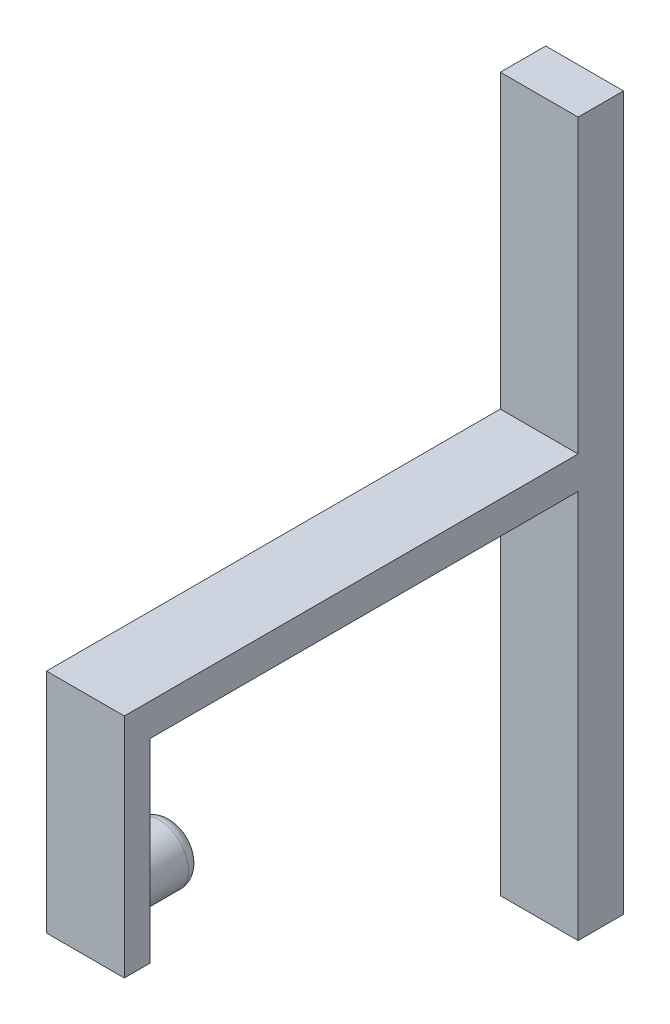
ISO-10303-21;
HEADER;
FILE_DESCRIPTION(('STEP AP214'),'2;1');
FILE_NAME('part.step','',(''),(''),'','','');
FILE_SCHEMA(('AUTOMOTIVE_DESIGN { 1 0 10303 214 1 1 1 1 }'));
ENDSEC;
DATA;
#1=APPLICATION_CONTEXT('core data for automotive mechanical design processes');
#2=APPLICATION_PROTOCOL_DEFINITION('international standard','automotive_design',2000,#1);
#3=PRODUCT_CONTEXT('',#1,'mechanical');
#4=PRODUCT('Part','Part','',(#3));
#5=PRODUCT_RELATED_PRODUCT_CATEGORY('part','',(#4));
#6=PRODUCT_DEFINITION_FORMATION('','',#4);
#7=PRODUCT_DEFINITION_CONTEXT('part definition',#1,'design');
#8=PRODUCT_DEFINITION('design','',#6,#7);
#9=PRODUCT_DEFINITION_SHAPE('','',#8);
#10=(LENGTH_UNIT() NAMED_UNIT(*) SI_UNIT(.MILLI.,.METRE.));
#11=(NAMED_UNIT(*) PLANE_ANGLE_UNIT() SI_UNIT($,.RADIAN.));
#12=(NAMED_UNIT(*) SI_UNIT($,.STERADIAN.) SOLID_ANGLE_UNIT());
#13=UNCERTAINTY_MEASURE_WITH_UNIT(LENGTH_MEASURE(1.E-05),#10,'distance_accuracy_value','');
#14=(GEOMETRIC_REPRESENTATION_CONTEXT(3) GLOBAL_UNCERTAINTY_ASSIGNED_CONTEXT((#13)) GLOBAL_UNIT_ASSIGNED_CONTEXT((#10,
#11,#12)) REPRESENTATION_CONTEXT('',''));
#15=CARTESIAN_POINT('',(0.,0.,0.));
#16=DIRECTION('',(0.,0.,1.));
#17=DIRECTION('',(1.,0.,0.));
#18=AXIS2_PLACEMENT_3D('',#15,#16,#17);
#19=CARTESIAN_POINT('',(0.,30.,38.5));
#20=DIRECTION('',(0.,1.,0.));
#21=DIRECTION('',(0.,0.,1.));
#22=AXIS2_PLACEMENT_3D('',#19,#20,#21);
#23=PLANE('',#22);
#24=DIRECTION('',(1.,0.,0.));
#25=VECTOR('',#24,1.);
#26=CARTESIAN_POINT('',(6.,30.,36.5));
#27=LINE('',#26,#25);
#28=CARTESIAN_POINT('',(0.,30.,36.5));
#29=VERTEX_POINT('',#28);
#30=CARTESIAN_POINT('',(6.,30.,36.5));
#31=VERTEX_POINT('',#30);
#32=EDGE_CURVE('E147',#29,#31,#27,.T.);
#33=ORIENTED_EDGE('',*,*,#32,.F.);
#34=DIRECTION('',(0.,0.,-1.));
#35=VECTOR('',#34,1.);
#36=CARTESIAN_POINT('',(0.,30.,38.5));
#37=LINE('',#36,#35);
#38=CARTESIAN_POINT('',(0.,30.,3.5));
#39=VERTEX_POINT('',#38);
#40=EDGE_CURVE('E160',#29,#39,#37,.T.);
#41=ORIENTED_EDGE('',*,*,#40,.T.);
#42=DIRECTION('',(1.,0.,0.));
#43=VECTOR('',#42,1.);
#44=CARTESIAN_POINT('',(0.,30.,3.5));
#45=LINE('',#44,#43);
#46=CARTESIAN_POINT('',(6.,30.,3.5));
#47=VERTEX_POINT('',#46);
#48=EDGE_CURVE('E156',#39,#47,#45,.T.);
#49=ORIENTED_EDGE('',*,*,#48,.T.);
#50=DIRECTION('',(0.,0.,-1.));
#51=VECTOR('',#50,1.);
#52=CARTESIAN_POINT('',(6.,30.,38.5));
#53=LINE('',#52,#51);
#54=EDGE_CURVE('E168',#31,#47,#53,.T.);
#55=ORIENTED_EDGE('',*,*,#54,.F.);
#56=EDGE_LOOP('',(#33,#41,#49,#55));
#57=FACE_BOUND('',#56,.T.);
#58=ADVANCED_FACE('F33',(#57),#23,.F.);
#59=CARTESIAN_POINT('',(0.,0.,3.5));
#60=DIRECTION('',(0.,0.,-1.));
#61=DIRECTION('',(-1.,0.,0.));
#62=AXIS2_PLACEMENT_3D('',#59,#60,#61);
#63=PLANE('',#62);
#64=ORIENTED_EDGE('',*,*,#48,.F.);
#65=DIRECTION('',(0.,-1.,0.));
#66=VECTOR('',#65,1.);
#67=CARTESIAN_POINT('',(0.,0.,3.5));
#68=LINE('',#67,#66);
#69=CARTESIAN_POINT('',(0.,0.,3.5));
#70=VERTEX_POINT('',#69);
#71=EDGE_CURVE('E86',#39,#70,#68,.T.);
#72=ORIENTED_EDGE('',*,*,#71,.T.);
#73=DIRECTION('',(1.,0.,0.));
#74=VECTOR('',#73,1.);
#75=CARTESIAN_POINT('',(0.,0.,3.5));
#76=LINE('',#75,#74);
#77=CARTESIAN_POINT('',(6.,0.,3.5));
#78=VERTEX_POINT('',#77);
#79=EDGE_CURVE('E173',#70,#78,#76,.T.);
#80=ORIENTED_EDGE('',*,*,#79,.T.);
#81=DIRECTION('',(0.,1.,0.));
#82=VECTOR('',#81,1.);
#83=CARTESIAN_POINT('',(6.,0.,3.5));
#84=LINE('',#83,#82);
#85=EDGE_CURVE('E176',#78,#47,#84,.T.);
#86=ORIENTED_EDGE('',*,*,#85,.T.);
#87=EDGE_LOOP('',(#64,#72,#80,#86));
#88=FACE_BOUND('',#87,.T.);
#89=ADVANCED_FACE('F213',(#88),#63,.F.);
#90=CARTESIAN_POINT('',(0.,0.,3.5));
#91=DIRECTION('',(1.,0.,0.));
#92=DIRECTION('',(0.,0.,-1.));
#93=AXIS2_PLACEMENT_3D('',#90,#91,#92);
#94=PLANE('',#93);
#95=DIRECTION('',(0.,-1.,0.));
#96=VECTOR('',#95,1.);
#97=CARTESIAN_POINT('',(0.,0.,0.));
#98=LINE('',#97,#96);
#99=CARTESIAN_POINT('',(0.,55.,0.));
#100=VERTEX_POINT('',#99);
#101=CARTESIAN_POINT('',(0.,0.,0.));
#102=VERTEX_POINT('',#101);
#103=EDGE_CURVE('E170',#100,#102,#98,.T.);
#104=ORIENTED_EDGE('',*,*,#103,.T.);
#105=DIRECTION('',(0.,0.,-1.));
#106=VECTOR('',#105,1.);
#107=CARTESIAN_POINT('',(0.,0.,3.5));
#108=LINE('',#107,#106);
#109=EDGE_CURVE('E194',#70,#102,#108,.T.);
#110=ORIENTED_EDGE('',*,*,#109,.F.);
#111=ORIENTED_EDGE('',*,*,#71,.F.);
#112=ORIENTED_EDGE('',*,*,#40,.F.);
#113=DIRECTION('',(0.,1.,0.));
#114=VECTOR('',#113,1.);
#115=CARTESIAN_POINT('',(0.,15.,36.5));
#116=LINE('',#115,#114);
#117=CARTESIAN_POINT('',(0.,15.,36.5));
#118=VERTEX_POINT('',#117);
#119=EDGE_CURVE('E155',#118,#29,#116,.T.);
#120=ORIENTED_EDGE('',*,*,#119,.F.);
#121=DIRECTION('',(0.,0.,-1.));
#122=VECTOR('',#121,1.);
#123=CARTESIAN_POINT('',(0.,15.,38.5));
#124=LINE('',#123,#122);
#125=CARTESIAN_POINT('',(0.,15.,38.5));
#126=VERTEX_POINT('',#125);
#127=EDGE_CURVE('E141',#126,#118,#124,.T.);
#128=ORIENTED_EDGE('',*,*,#127,.F.);
#129=DIRECTION('',(0.,1.,0.));
#130=VECTOR('',#129,1.);
#131=CARTESIAN_POINT('',(0.,30.,38.5));
#132=LINE('',#131,#130);
#133=CARTESIAN_POINT('',(0.,32.5,38.5));
#134=VERTEX_POINT('',#133);
#135=EDGE_CURVE('E138',#126,#134,#132,.T.);
#136=ORIENTED_EDGE('',*,*,#135,.T.);
#137=DIRECTION('',(0.,0.,-1.));
#138=VECTOR('',#137,1.);
#139=CARTESIAN_POINT('',(0.,32.5,38.5));
#140=LINE('',#139,#138);
#141=CARTESIAN_POINT('',(0.,32.5,3.5));
#142=VERTEX_POINT('',#141);
#143=EDGE_CURVE('E165',#134,#142,#140,.T.);
#144=ORIENTED_EDGE('',*,*,#143,.T.);
#145=CARTESIAN_POINT('',(0.,55.,3.5));
#146=VERTEX_POINT('',#145);
#147=EDGE_CURVE('E171',#146,#142,#68,.T.);
#148=ORIENTED_EDGE('',*,*,#147,.F.);
#149=DIRECTION('',(0.,0.,-1.));
#150=VECTOR('',#149,1.);
#151=CARTESIAN_POINT('',(0.,55.,3.5));
#152=LINE('',#151,#150);
#153=EDGE_CURVE('E180',#146,#100,#152,.T.);
#154=ORIENTED_EDGE('',*,*,#153,.T.);
#155=EDGE_LOOP('',(#104,#110,#111,#112,#120,#128,#136,#144,#148,#154));
#156=FACE_BOUND('',#155,.T.);
#157=ADVANCED_FACE('F219',(#156),#94,.F.);
#158=CARTESIAN_POINT('',(0.,0.,3.5));
#159=DIRECTION('',(0.,1.,0.));
#160=DIRECTION('',(0.,0.,1.));
#161=AXIS2_PLACEMENT_3D('',#158,#159,#160);
#162=PLANE('',#161);
#163=DIRECTION('',(1.,0.,0.));
#164=VECTOR('',#163,1.);
#165=CARTESIAN_POINT('',(0.,0.,0.));
#166=LINE('',#165,#164);
#167=CARTESIAN_POINT('',(6.,0.,0.));
#168=VERTEX_POINT('',#167);
#169=EDGE_CURVE('E183',#102,#168,#166,.T.);
#170=ORIENTED_EDGE('',*,*,#169,.T.);
#171=DIRECTION('',(0.,0.,-1.));
#172=VECTOR('',#171,1.);
#173=CARTESIAN_POINT('',(6.,0.,3.5));
#174=LINE('',#173,#172);
#175=EDGE_CURVE('E191',#78,#168,#174,.T.);
#176=ORIENTED_EDGE('',*,*,#175,.F.);
#177=ORIENTED_EDGE('',*,*,#79,.F.);
#178=ORIENTED_EDGE('',*,*,#109,.T.);
#179=EDGE_LOOP('',(#170,#176,#177,#178));
#180=FACE_BOUND('',#179,.T.);
#181=ADVANCED_FACE('F237',(#180),#162,.F.);
#182=CARTESIAN_POINT('',(6.,0.,3.5));
#183=DIRECTION('',(-1.,0.,0.));
#184=DIRECTION('',(0.,0.,1.));
#185=AXIS2_PLACEMENT_3D('',#182,#183,#184);
#186=PLANE('',#185);
#187=DIRECTION('',(0.,1.,0.));
#188=VECTOR('',#187,1.);
#189=CARTESIAN_POINT('',(6.,0.,0.));
#190=LINE('',#189,#188);
#191=CARTESIAN_POINT('',(6.,55.,0.));
#192=VERTEX_POINT('',#191);
#193=EDGE_CURVE('E185',#168,#192,#190,.T.);
#194=ORIENTED_EDGE('',*,*,#193,.T.);
#195=DIRECTION('',(0.,0.,-1.));
#196=VECTOR('',#195,1.);
#197=CARTESIAN_POINT('',(6.,55.,3.5));
#198=LINE('',#197,#196);
#199=CARTESIAN_POINT('',(6.,55.,3.5));
#200=VERTEX_POINT('',#199);
#201=EDGE_CURVE('E189',#200,#192,#198,.T.);
#202=ORIENTED_EDGE('',*,*,#201,.F.);
#203=CARTESIAN_POINT('',(6.,32.5,3.5));
#204=VERTEX_POINT('',#203);
#205=EDGE_CURVE('E175',#204,#200,#84,.T.);
#206=ORIENTED_EDGE('',*,*,#205,.F.);
#207=DIRECTION('',(0.,0.,-1.));
#208=VECTOR('',#207,1.);
#209=CARTESIAN_POINT('',(6.,32.5,38.5));
#210=LINE('',#209,#208);
#211=CARTESIAN_POINT('',(6.,32.5,38.5));
#212=VERTEX_POINT('',#211);
#213=EDGE_CURVE('E48',#212,#204,#210,.T.);
#214=ORIENTED_EDGE('',*,*,#213,.F.);
#215=DIRECTION('',(0.,1.,0.));
#216=VECTOR('',#215,1.);
#217=CARTESIAN_POINT('',(6.,30.,38.5));
#218=LINE('',#217,#216);
#219=CARTESIAN_POINT('',(6.,15.,38.5));
#220=VERTEX_POINT('',#219);
#221=EDGE_CURVE('E122',#220,#212,#218,.T.);
#222=ORIENTED_EDGE('',*,*,#221,.F.);
#223=DIRECTION('',(0.,0.,1.));
#224=VECTOR('',#223,1.);
#225=CARTESIAN_POINT('',(6.,15.,38.5));
#226=LINE('',#225,#224);
#227=CARTESIAN_POINT('',(6.,15.,36.5));
#228=VERTEX_POINT('',#227);
#229=EDGE_CURVE('E127',#228,#220,#226,.T.);
#230=ORIENTED_EDGE('',*,*,#229,.F.);
#231=DIRECTION('',(0.,1.,0.));
#232=VECTOR('',#231,1.);
#233=CARTESIAN_POINT('',(6.,15.,36.5));
#234=LINE('',#233,#232);
#235=EDGE_CURVE('E152',#228,#31,#234,.T.);
#236=ORIENTED_EDGE('',*,*,#235,.T.);
#237=ORIENTED_EDGE('',*,*,#54,.T.);
#238=ORIENTED_EDGE('',*,*,#85,.F.);
#239=ORIENTED_EDGE('',*,*,#175,.T.);
#240=EDGE_LOOP('',(#194,#202,#206,#214,#222,#230,#236,#237,#238,#239));
#241=FACE_BOUND('',#240,.T.);
#242=ADVANCED_FACE('F124',(#241),#186,.F.);
#243=CARTESIAN_POINT('',(0.,55.,3.5));
#244=DIRECTION('',(0.,-1.,0.));
#245=DIRECTION('',(0.,0.,-1.));
#246=AXIS2_PLACEMENT_3D('',#243,#244,#245);
#247=PLANE('',#246);
#248=DIRECTION('',(-1.,0.,0.));
#249=VECTOR('',#248,1.);
#250=CARTESIAN_POINT('',(0.,55.,0.));
#251=LINE('',#250,#249);
#252=EDGE_CURVE('E78',#192,#100,#251,.T.);
#253=ORIENTED_EDGE('',*,*,#252,.T.);
#254=ORIENTED_EDGE('',*,*,#153,.F.);
#255=DIRECTION('',(-1.,0.,0.));
#256=VECTOR('',#255,1.);
#257=CARTESIAN_POINT('',(0.,55.,3.5));
#258=LINE('',#257,#256);
#259=EDGE_CURVE('E57',#200,#146,#258,.T.);
#260=ORIENTED_EDGE('',*,*,#259,.F.);
#261=ORIENTED_EDGE('',*,*,#201,.T.);
#262=EDGE_LOOP('',(#253,#254,#260,#261));
#263=FACE_BOUND('',#262,.T.);
#264=ADVANCED_FACE('F229',(#263),#247,.F.);
#265=ORIENTED_EDGE('',*,*,#147,.T.);
#266=DIRECTION('',(1.,0.,0.));
#267=VECTOR('',#266,1.);
#268=CARTESIAN_POINT('',(0.,32.5,3.5));
#269=LINE('',#268,#267);
#270=EDGE_CURVE('E132',#142,#204,#269,.T.);
#271=ORIENTED_EDGE('',*,*,#270,.T.);
#272=ORIENTED_EDGE('',*,*,#205,.T.);
#273=ORIENTED_EDGE('',*,*,#259,.T.);
#274=EDGE_LOOP('',(#265,#271,#272,#273));
#275=FACE_BOUND('',#274,.T.);
#276=ADVANCED_FACE('F221',(#275),#63,.F.);
#277=CARTESIAN_POINT('',(0.,0.,0.));
#278=DIRECTION('',(0.,0.,-1.));
#279=DIRECTION('',(-1.,0.,0.));
#280=AXIS2_PLACEMENT_3D('',#277,#278,#279);
#281=PLANE('',#280);
#282=ORIENTED_EDGE('',*,*,#103,.F.);
#283=ORIENTED_EDGE('',*,*,#252,.F.);
#284=ORIENTED_EDGE('',*,*,#193,.F.);
#285=ORIENTED_EDGE('',*,*,#169,.F.);
#286=EDGE_LOOP('',(#282,#283,#284,#285));
#287=FACE_BOUND('',#286,.T.);
#288=ADVANCED_FACE('F228',(#287),#281,.T.);
#289=CARTESIAN_POINT('',(0.,32.5,38.5));
#290=DIRECTION('',(0.,1.,0.));
#291=DIRECTION('',(0.,0.,1.));
#292=AXIS2_PLACEMENT_3D('',#289,#290,#291);
#293=PLANE('',#292);
#294=ORIENTED_EDGE('',*,*,#270,.F.);
#295=ORIENTED_EDGE('',*,*,#143,.F.);
#296=DIRECTION('',(1.,0.,0.));
#297=VECTOR('',#296,1.);
#298=CARTESIAN_POINT('',(0.,32.5,38.5));
#299=LINE('',#298,#297);
#300=EDGE_CURVE('E131',#134,#212,#299,.T.);
#301=ORIENTED_EDGE('',*,*,#300,.T.);
#302=ORIENTED_EDGE('',*,*,#213,.T.);
#303=EDGE_LOOP('',(#294,#295,#301,#302));
#304=FACE_BOUND('',#303,.T.);
#305=ADVANCED_FACE('F224',(#304),#293,.T.);
#306=CARTESIAN_POINT('',(0.,0.,38.5));
#307=DIRECTION('',(0.,0.,1.));
#308=DIRECTION('',(1.,0.,0.));
#309=AXIS2_PLACEMENT_3D('',#306,#307,#308);
#310=PLANE('',#309);
#311=ORIENTED_EDGE('',*,*,#135,.F.);
#312=DIRECTION('',(-1.,0.,0.));
#313=VECTOR('',#312,1.);
#314=CARTESIAN_POINT('',(6.,15.,38.5));
#315=LINE('',#314,#313);
#316=EDGE_CURVE('E135',#220,#126,#315,.T.);
#317=ORIENTED_EDGE('',*,*,#316,.F.);
#318=ORIENTED_EDGE('',*,*,#221,.T.);
#319=ORIENTED_EDGE('',*,*,#300,.F.);
#320=EDGE_LOOP('',(#311,#317,#318,#319));
#321=FACE_BOUND('',#320,.T.);
#322=ADVANCED_FACE('F136',(#321),#310,.T.);
#323=CARTESIAN_POINT('',(6.,15.,36.5));
#324=DIRECTION('',(0.,0.,1.));
#325=DIRECTION('',(1.,0.,0.));
#326=AXIS2_PLACEMENT_3D('',#323,#324,#325);
#327=PLANE('',#326);
#328=CARTESIAN_POINT('',(3.,18.95,36.5));
#329=DIRECTION('',(0.,0.,1.));
#330=DIRECTION('',(1.,0.,0.));
#331=AXIS2_PLACEMENT_3D('',#328,#329,#330);
#332=CIRCLE('',#331,2.25);
#333=CARTESIAN_POINT('',(5.25,18.95,36.5));
#334=VERTEX_POINT('',#333);
#335=EDGE_CURVE('E197',#334,#334,#332,.F.);
#336=ORIENTED_EDGE('',*,*,#335,.F.);
#337=EDGE_LOOP('',(#336));
#338=FACE_BOUND('',#337,.T.);
#339=ORIENTED_EDGE('',*,*,#32,.T.);
#340=ORIENTED_EDGE('',*,*,#235,.F.);
#341=DIRECTION('',(1.,0.,0.));
#342=VECTOR('',#341,1.);
#343=CARTESIAN_POINT('',(6.,15.,36.5));
#344=LINE('',#343,#342);
#345=EDGE_CURVE('E145',#118,#228,#344,.T.);
#346=ORIENTED_EDGE('',*,*,#345,.F.);
#347=ORIENTED_EDGE('',*,*,#119,.T.);
#348=EDGE_LOOP('',(#339,#340,#346,#347));
#349=FACE_BOUND('',#348,.T.);
#350=ADVANCED_FACE('F254',(#338,#349),#327,.F.);
#351=CARTESIAN_POINT('',(0.,15.,0.));
#352=DIRECTION('',(0.,1.,0.));
#353=DIRECTION('',(0.,0.,1.));
#354=AXIS2_PLACEMENT_3D('',#351,#352,#353);
#355=PLANE('',#354);
#356=ORIENTED_EDGE('',*,*,#229,.T.);
#357=ORIENTED_EDGE('',*,*,#316,.T.);
#358=ORIENTED_EDGE('',*,*,#127,.T.);
#359=ORIENTED_EDGE('',*,*,#345,.T.);
#360=EDGE_LOOP('',(#356,#357,#358,#359));
#361=FACE_BOUND('',#360,.T.);
#362=ADVANCED_FACE('F143',(#361),#355,.F.);
#363=CARTESIAN_POINT('',(3.,18.95,31.8));
#364=DIRECTION('',(0.,0.,1.));
#365=DIRECTION('',(1.,0.,0.));
#366=AXIS2_PLACEMENT_3D('',#363,#364,#365);
#367=CYLINDRICAL_SURFACE('',#366,2.25);
#368=CARTESIAN_POINT('',(3.,18.95,32.8));
#369=DIRECTION('',(0.,0.,-1.));
#370=DIRECTION('',(-1.,0.,0.));
#371=AXIS2_PLACEMENT_3D('',#368,#369,#370);
#372=CIRCLE('',#371,2.25);
#373=CARTESIAN_POINT('',(0.750000000000001,18.95,32.8));
#374=VERTEX_POINT('',#373);
#375=EDGE_CURVE('E11',#374,#374,#372,.F.);
#376=ORIENTED_EDGE('',*,*,#375,.T.);
#377=EDGE_LOOP('',(#376));
#378=FACE_BOUND('',#377,.T.);
#379=ORIENTED_EDGE('',*,*,#335,.T.);
#380=EDGE_LOOP('',(#379));
#381=FACE_BOUND('',#380,.T.);
#382=ADVANCED_FACE('F209',(#378,#381),#367,.T.);
#383=CARTESIAN_POINT('',(3.,18.95,31.8));
#384=DIRECTION('',(0.,0.,-1.));
#385=DIRECTION('',(-1.,0.,0.));
#386=AXIS2_PLACEMENT_3D('',#383,#384,#385);
#387=PLANE('',#386);
#388=CARTESIAN_POINT('',(3.,18.95,31.8));
#389=DIRECTION('',(0.,0.,-1.));
#390=DIRECTION('',(-1.,0.,0.));
#391=AXIS2_PLACEMENT_3D('',#388,#389,#390);
#392=CIRCLE('',#391,1.25);
#393=CARTESIAN_POINT('',(1.75,18.95,31.8));
#394=VERTEX_POINT('',#393);
#395=EDGE_CURVE('E41',#394,#394,#392,.T.);
#396=ORIENTED_EDGE('',*,*,#395,.T.);
#397=EDGE_LOOP('',(#396));
#398=FACE_BOUND('',#397,.T.);
#399=ADVANCED_FACE('F202',(#398),#387,.T.);
#400=CARTESIAN_POINT('',(3.,18.95,32.8));
#401=DIRECTION('',(0.,0.,-1.));
#402=DIRECTION('',(-1.,0.,0.));
#403=AXIS2_PLACEMENT_3D('',#400,#401,#402);
#404=TOROIDAL_SURFACE('',#403,1.25,1.);
#405=ORIENTED_EDGE('',*,*,#375,.F.);
#406=EDGE_LOOP('',(#405));
#407=FACE_BOUND('',#406,.T.);
#408=ORIENTED_EDGE('',*,*,#395,.F.);
#409=EDGE_LOOP('',(#408));
#410=FACE_BOUND('',#409,.T.);
#411=ADVANCED_FACE('F35',(#407,#410),#404,.T.);
#412=CLOSED_SHELL('',(#58,#89,#157,#181,#242,#264,#276,#288,#305,#322,#350,#362,#382,#399,#411));
#413=MANIFOLD_SOLID_BREP('B2',#412);
#414=ADVANCED_BREP_SHAPE_REPRESENTATION('',(#18,#413),#14);
#415=SHAPE_DEFINITION_REPRESENTATION(#9,#414);
ENDSEC;
END-ISO-10303-21;
